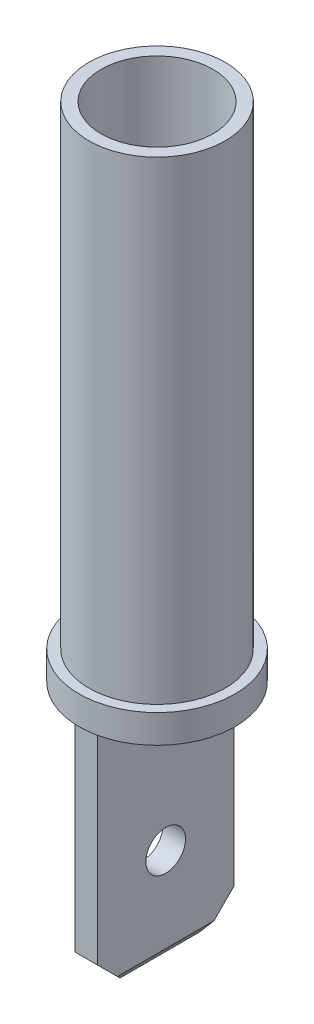
ISO-10303-21;
HEADER;
FILE_DESCRIPTION(('STEP AP214'),'2;1');
FILE_NAME('part.step','',(''),(''),'','','');
FILE_SCHEMA(('AUTOMOTIVE_DESIGN { 1 0 10303 214 1 1 1 1 }'));
ENDSEC;
DATA;
#1=APPLICATION_CONTEXT('core data for automotive mechanical design processes');
#2=APPLICATION_PROTOCOL_DEFINITION('international standard','automotive_design',2000,#1);
#3=PRODUCT_CONTEXT('',#1,'mechanical');
#4=PRODUCT('Part','Part','',(#3));
#5=PRODUCT_RELATED_PRODUCT_CATEGORY('part','',(#4));
#6=PRODUCT_DEFINITION_FORMATION('','',#4);
#7=PRODUCT_DEFINITION_CONTEXT('part definition',#1,'design');
#8=PRODUCT_DEFINITION('design','',#6,#7);
#9=PRODUCT_DEFINITION_SHAPE('','',#8);
#10=(LENGTH_UNIT() NAMED_UNIT(*) SI_UNIT(.MILLI.,.METRE.));
#11=(NAMED_UNIT(*) PLANE_ANGLE_UNIT() SI_UNIT($,.RADIAN.));
#12=(NAMED_UNIT(*) SI_UNIT($,.STERADIAN.) SOLID_ANGLE_UNIT());
#13=UNCERTAINTY_MEASURE_WITH_UNIT(LENGTH_MEASURE(1.E-05),#10,'distance_accuracy_value','');
#14=(GEOMETRIC_REPRESENTATION_CONTEXT(3) GLOBAL_UNCERTAINTY_ASSIGNED_CONTEXT((#13)) GLOBAL_UNIT_ASSIGNED_CONTEXT((#10,
#11,#12)) REPRESENTATION_CONTEXT('',''));
#15=CARTESIAN_POINT('',(0.,0.,0.));
#16=DIRECTION('',(0.,0.,1.));
#17=DIRECTION('',(1.,0.,0.));
#18=AXIS2_PLACEMENT_3D('',#15,#16,#17);
#19=CARTESIAN_POINT('',(0.400000000000001,-8.2,-2.30424845809455));
#20=DIRECTION('',(0.,-1.,0.));
#21=DIRECTION('',(0.,0.,-1.));
#22=AXIS2_PLACEMENT_3D('',#19,#20,#21);
#23=PLANE('',#22);
#24=DIRECTION('',(1.,0.,0.));
#25=VECTOR('',#24,1.);
#26=CARTESIAN_POINT('',(0.400000000000001,-8.2,-1.30424845809455));
#27=LINE('',#26,#25);
#28=CARTESIAN_POINT('',(0.189937738364052,-8.20000000002442,-1.30424845809455));
#29=VERTEX_POINT('',#28);
#30=CARTESIAN_POINT('',(-0.189937738984123,-8.1999999999369,-1.30424845809455));
#31=VERTEX_POINT('',#30);
#32=EDGE_CURVE('E102',#29,#31,#27,.F.);
#33=ORIENTED_EDGE('',*,*,#32,.F.);
#34=DIRECTION('',(0.,0.,1.));
#35=VECTOR('',#34,1.);
#36=CARTESIAN_POINT('',(0.189937738468687,-8.20000000009769,-2.30424845809455));
#37=LINE('',#36,#35);
#38=CARTESIAN_POINT('',(0.18993773829884,-8.20000000002442,1.49575154246425));
#39=VERTEX_POINT('',#38);
#40=EDGE_CURVE('E199',#39,#29,#37,.F.);
#41=ORIENTED_EDGE('',*,*,#40,.F.);
#42=DIRECTION('',(1.,0.,0.));
#43=VECTOR('',#42,1.);
#44=CARTESIAN_POINT('',(0.400000000000001,-8.2,1.49575154265051));
#45=LINE('',#44,#43);
#46=CARTESIAN_POINT('',(-0.189937738984123,-8.1999999999369,1.49575154227798));
#47=VERTEX_POINT('',#46);
#48=EDGE_CURVE('E108',#39,#47,#45,.F.);
#49=ORIENTED_EDGE('',*,*,#48,.T.);
#50=DIRECTION('',(0.,0.,1.));
#51=VECTOR('',#50,1.);
#52=CARTESIAN_POINT('',(-0.189937738713802,-8.19999999974763,-2.30424845809455));
#53=LINE('',#52,#51);
#54=EDGE_CURVE('E106',#31,#47,#53,.T.);
#55=ORIENTED_EDGE('',*,*,#54,.F.);
#56=EDGE_LOOP('',(#33,#41,#49,#55));
#57=FACE_BOUND('',#56,.T.);
#58=ADVANCED_FACE('F17',(#57),#23,.T.);
#59=CARTESIAN_POINT('',(-0.189937738537087,-8.2,-2.30424845809455));
#60=DIRECTION('',(-0.819152044288994,-0.573576436351043,0.));
#61=DIRECTION('',(0.573576436351043,-0.819152044288994,0.));
#62=AXIS2_PLACEMENT_3D('',#59,#60,#61);
#63=PLANE('',#62);
#64=DIRECTION('',(-0.443712605902055,0.633687274356844,-0.63368727435684));
#65=VECTOR('',#64,1.);
#66=CARTESIAN_POINT('',(-0.18993773907423,-8.2,-1.30424845809455));
#67=LINE('',#66,#65);
#68=CARTESIAN_POINT('',(-0.400000000302383,-7.89999999953464,-1.6042484579885));
#69=VERTEX_POINT('',#68);
#70=EDGE_CURVE('E115',#31,#69,#67,.T.);
#71=ORIENTED_EDGE('',*,*,#70,.F.);
#72=ORIENTED_EDGE('',*,*,#54,.T.);
#73=DIRECTION('',(0.44371260545955,-0.633687274511767,-0.633687274511763));
#74=VECTOR('',#73,1.);
#75=CARTESIAN_POINT('',(-0.400000000462119,-7.89999999941673,1.79575154248872));
#76=LINE('',#75,#74);
#77=CARTESIAN_POINT('',(-0.40000000010652,-7.89999999974041,1.79575154215873));
#78=VERTEX_POINT('',#77);
#79=EDGE_CURVE('E196',#78,#47,#76,.T.);
#80=ORIENTED_EDGE('',*,*,#79,.F.);
#81=DIRECTION('',(0.,0.,-1.));
#82=VECTOR('',#81,1.);
#83=CARTESIAN_POINT('',(-0.4,-7.89999999941673,2.49575154190545));
#84=LINE('',#83,#82);
#85=EDGE_CURVE('E118',#78,#69,#84,.T.);
#86=ORIENTED_EDGE('',*,*,#85,.T.);
#87=EDGE_LOOP('',(#71,#72,#80,#86));
#88=FACE_BOUND('',#87,.T.);
#89=ADVANCED_FACE('F116',(#88),#63,.T.);
#90=CARTESIAN_POINT('',(-0.4,-8.2,-2.30424845809455));
#91=DIRECTION('',(0.,0.,1.));
#92=DIRECTION('',(1.,0.,0.));
#93=AXIS2_PLACEMENT_3D('',#90,#91,#92);
#94=PLANE('',#93);
#95=DIRECTION('',(0.,1.,0.));
#96=VECTOR('',#95,1.);
#97=CARTESIAN_POINT('',(0.400000000000001,-8.2,-2.30424845812955));
#98=LINE('',#97,#96);
#99=CARTESIAN_POINT('',(0.400000000062089,0.,-2.30424845802329));
#100=VERTEX_POINT('',#99);
#101=CARTESIAN_POINT('',(0.400000000000001,-7.20000000008438,-2.30424845819643));
#102=VERTEX_POINT('',#101);
#103=EDGE_CURVE('E216',#100,#102,#98,.F.);
#104=ORIENTED_EDGE('',*,*,#103,.T.);
#105=DIRECTION('',(1.,0.,0.));
#106=VECTOR('',#105,1.);
#107=CARTESIAN_POINT('',(0.400000000000001,-7.19999999962747,-2.30424845846708));
#108=LINE('',#107,#106);
#109=CARTESIAN_POINT('',(-0.400000000271819,-7.19999999981373,-2.30424845846708));
#110=VERTEX_POINT('',#109);
#111=EDGE_CURVE('E123',#110,#102,#108,.T.);
#112=ORIENTED_EDGE('',*,*,#111,.F.);
#113=DIRECTION('',(0.,1.,0.));
#114=VECTOR('',#113,1.);
#115=CARTESIAN_POINT('',(-0.4,-8.2,-2.30424845883961));
#116=LINE('',#115,#114);
#117=CARTESIAN_POINT('',(-0.400000000279397,0.,-2.30424845820081));
#118=VERTEX_POINT('',#117);
#119=EDGE_CURVE('E175',#110,#118,#116,.T.);
#120=ORIENTED_EDGE('',*,*,#119,.T.);
#121=DIRECTION('',(1.,0.,0.));
#122=VECTOR('',#121,1.);
#123=CARTESIAN_POINT('',(-0.4,0.,-2.30424845809455));
#124=LINE('',#123,#122);
#125=EDGE_CURVE('E112',#100,#118,#124,.F.);
#126=ORIENTED_EDGE('',*,*,#125,.F.);
#127=EDGE_LOOP('',(#104,#112,#120,#126));
#128=FACE_BOUND('',#127,.T.);
#129=ADVANCED_FACE('F231',(#128),#94,.F.);
#130=CARTESIAN_POINT('',(0.400000000000001,-8.2,-1.30424845809455));
#131=DIRECTION('',(0.,-0.707106781186546,-0.707106781186549));
#132=DIRECTION('',(0.,0.707106781186549,-0.707106781186546));
#133=AXIS2_PLACEMENT_3D('',#130,#131,#132);
#134=PLANE('',#133);
#135=DIRECTION('',(0.,-0.707106780570773,0.707106781802322));
#136=VECTOR('',#135,1.);
#137=CARTESIAN_POINT('',(0.400000000000001,-7.2,-2.30424845883961));
#138=LINE('',#137,#136);
#139=CARTESIAN_POINT('',(0.400000000048028,-7.89999999969214,-1.60424845820621));
#140=VERTEX_POINT('',#139);
#141=EDGE_CURVE('E207',#102,#140,#138,.T.);
#142=ORIENTED_EDGE('',*,*,#141,.T.);
#143=DIRECTION('',(0.443712606522206,0.63368727457104,-0.63368727370841));
#144=VECTOR('',#143,1.);
#145=CARTESIAN_POINT('',(0.189937738468687,-8.20000000009769,-1.30424845809455));
#146=LINE('',#145,#144);
#147=EDGE_CURVE('E127',#29,#140,#146,.T.);
#148=ORIENTED_EDGE('',*,*,#147,.F.);
#149=ORIENTED_EDGE('',*,*,#32,.T.);
#150=ORIENTED_EDGE('',*,*,#70,.T.);
#151=DIRECTION('',(0.,0.707106780433923,-0.707106781939173));
#152=VECTOR('',#151,1.);
#153=CARTESIAN_POINT('',(-0.4,-7.89999999956632,-1.60424845778317));
#154=LINE('',#153,#152);
#155=EDGE_CURVE('E170',#69,#110,#154,.T.);
#156=ORIENTED_EDGE('',*,*,#155,.T.);
#157=ORIENTED_EDGE('',*,*,#111,.T.);
#158=EDGE_LOOP('',(#142,#148,#149,#150,#156,#157));
#159=FACE_BOUND('',#158,.T.);
#160=ADVANCED_FACE('F125',(#159),#134,.T.);
#161=CARTESIAN_POINT('',(0.18993773853709,-8.2,-2.30424845809455));
#162=DIRECTION('',(0.819152044288993,-0.573576436351044,0.));
#163=DIRECTION('',(0.573576436351044,0.819152044288993,0.));
#164=AXIS2_PLACEMENT_3D('',#161,#162,#163);
#165=PLANE('',#164);
#166=DIRECTION('',(0.443712606189862,0.633687274256082,0.633687274256079));
#167=VECTOR('',#166,1.);
#168=CARTESIAN_POINT('',(0.189937738329173,-8.19999999962747,1.49575154227798));
#169=LINE('',#168,#167);
#170=CARTESIAN_POINT('',(0.400000000096055,-7.89999999956711,1.7957515424609));
#171=VERTEX_POINT('',#170);
#172=EDGE_CURVE('E191',#39,#171,#169,.T.);
#173=ORIENTED_EDGE('',*,*,#172,.F.);
#174=ORIENTED_EDGE('',*,*,#40,.T.);
#175=ORIENTED_EDGE('',*,*,#147,.T.);
#176=DIRECTION('',(0.,0.,1.));
#177=VECTOR('',#176,1.);
#178=CARTESIAN_POINT('',(0.400000000000001,-7.89999999956223,2.49575154190545));
#179=LINE('',#178,#177);
#180=EDGE_CURVE('E163',#140,#171,#179,.T.);
#181=ORIENTED_EDGE('',*,*,#180,.T.);
#182=EDGE_LOOP('',(#173,#174,#175,#181));
#183=FACE_BOUND('',#182,.T.);
#184=ADVANCED_FACE('F246',(#183),#165,.T.);
#185=CARTESIAN_POINT('',(0.400000000000001,-8.2,1.49575154190545));
#186=DIRECTION('',(0.,-0.707106781186546,0.707106781186549));
#187=DIRECTION('',(0.,-0.707106781186549,-0.707106781186546));
#188=AXIS2_PLACEMENT_3D('',#185,#186,#187);
#189=PLANE('',#188);
#190=DIRECTION('',(0.,0.707106781186547,0.707106781186548));
#191=VECTOR('',#190,1.);
#192=CARTESIAN_POINT('',(0.400000000000001,-7.89999999925494,1.79575154265051));
#193=LINE('',#192,#191);
#194=CARTESIAN_POINT('',(0.400000000093133,-7.2,2.49575154190545));
#195=VERTEX_POINT('',#194);
#196=EDGE_CURVE('E159',#171,#195,#193,.T.);
#197=ORIENTED_EDGE('',*,*,#196,.T.);
#198=DIRECTION('',(-1.,0.,0.));
#199=VECTOR('',#198,1.);
#200=CARTESIAN_POINT('',(-0.4,-7.2,2.49575154190545));
#201=LINE('',#200,#199);
#202=CARTESIAN_POINT('',(-0.4,-7.20000000019939,2.49575154170606));
#203=VERTEX_POINT('',#202);
#204=EDGE_CURVE('E189',#195,#203,#201,.T.);
#205=ORIENTED_EDGE('',*,*,#204,.T.);
#206=DIRECTION('',(0.,-0.707106781186547,-0.707106781186548));
#207=VECTOR('',#206,1.);
#208=CARTESIAN_POINT('',(-0.4,-7.2,2.49575154190545));
#209=LINE('',#208,#207);
#210=EDGE_CURVE('E179',#203,#78,#209,.T.);
#211=ORIENTED_EDGE('',*,*,#210,.T.);
#212=ORIENTED_EDGE('',*,*,#79,.T.);
#213=ORIENTED_EDGE('',*,*,#48,.F.);
#214=ORIENTED_EDGE('',*,*,#172,.T.);
#215=EDGE_LOOP('',(#197,#205,#211,#212,#213,#214));
#216=FACE_BOUND('',#215,.T.);
#217=ADVANCED_FACE('F243',(#216),#189,.T.);
#218=CARTESIAN_POINT('',(-0.4,-8.2,2.49575154190545));
#219=DIRECTION('',(0.,0.,-1.));
#220=DIRECTION('',(-1.,0.,0.));
#221=AXIS2_PLACEMENT_3D('',#218,#219,#220);
#222=PLANE('',#221);
#223=DIRECTION('',(0.,1.,0.));
#224=VECTOR('',#223,1.);
#225=CARTESIAN_POINT('',(-0.4,-8.2,2.49575154110789));
#226=LINE('',#225,#224);
#227=CARTESIAN_POINT('',(-0.400000000093132,0.,2.49575154150667));
#228=VERTEX_POINT('',#227);
#229=EDGE_CURVE('E183',#228,#203,#226,.F.);
#230=ORIENTED_EDGE('',*,*,#229,.T.);
#231=ORIENTED_EDGE('',*,*,#204,.F.);
#232=DIRECTION('',(0.,1.,0.));
#233=VECTOR('',#232,1.);
#234=CARTESIAN_POINT('',(0.400000000000001,-8.2,2.49575154190545));
#235=LINE('',#234,#233);
#236=CARTESIAN_POINT('',(0.400000000248353,0.,2.49575154170606));
#237=VERTEX_POINT('',#236);
#238=EDGE_CURVE('E156',#195,#237,#235,.T.);
#239=ORIENTED_EDGE('',*,*,#238,.T.);
#240=DIRECTION('',(-1.,0.,0.));
#241=VECTOR('',#240,1.);
#242=CARTESIAN_POINT('',(-0.4,0.,2.49575154190545));
#243=LINE('',#242,#241);
#244=EDGE_CURVE('E42',#228,#237,#243,.F.);
#245=ORIENTED_EDGE('',*,*,#244,.F.);
#246=EDGE_LOOP('',(#230,#231,#239,#245));
#247=FACE_BOUND('',#246,.T.);
#248=ADVANCED_FACE('F241',(#247),#222,.F.);
#249=CARTESIAN_POINT('',(-2.751,-4.9,0.0957515419054487));
#250=DIRECTION('',(1.,0.,0.));
#251=DIRECTION('',(0.,0.,-1.));
#252=AXIS2_PLACEMENT_3D('',#249,#250,#251);
#253=CYLINDRICAL_SURFACE('',#252,0.7);
#254=CARTESIAN_POINT('',(0.400000000000001,-4.9,0.0957515419054487));
#255=DIRECTION('',(1.,0.,0.));
#256=DIRECTION('',(0.,0.,-1.));
#257=AXIS2_PLACEMENT_3D('',#254,#255,#256);
#258=CIRCLE('',#257,0.7);
#259=CARTESIAN_POINT('',(0.400000000000001,-4.9,-0.604248458094551));
#260=VERTEX_POINT('',#259);
#261=EDGE_CURVE('E155',#260,#260,#258,.T.);
#262=ORIENTED_EDGE('',*,*,#261,.T.);
#263=EDGE_LOOP('',(#262));
#264=FACE_BOUND('',#263,.T.);
#265=CARTESIAN_POINT('',(-0.4,-4.9,0.0957515419054487));
#266=DIRECTION('',(1.,0.,0.));
#267=DIRECTION('',(0.,0.,-1.));
#268=AXIS2_PLACEMENT_3D('',#265,#266,#267);
#269=CIRCLE('',#268,0.7);
#270=CARTESIAN_POINT('',(-0.4,-4.9,-0.604248458094551));
#271=VERTEX_POINT('',#270);
#272=EDGE_CURVE('E21',#271,#271,#269,.F.);
#273=ORIENTED_EDGE('',*,*,#272,.T.);
#274=EDGE_LOOP('',(#273));
#275=FACE_BOUND('',#274,.T.);
#276=ADVANCED_FACE('F291',(#264,#275),#253,.F.);
#277=CARTESIAN_POINT('',(-0.4,-8.2,2.49575154190545));
#278=DIRECTION('',(1.,0.,0.));
#279=DIRECTION('',(0.,0.,-1.));
#280=AXIS2_PLACEMENT_3D('',#277,#278,#279);
#281=PLANE('',#280);
#282=ORIENTED_EDGE('',*,*,#272,.F.);
#283=EDGE_LOOP('',(#282));
#284=FACE_BOUND('',#283,.T.);
#285=ORIENTED_EDGE('',*,*,#155,.F.);
#286=ORIENTED_EDGE('',*,*,#85,.F.);
#287=ORIENTED_EDGE('',*,*,#210,.F.);
#288=ORIENTED_EDGE('',*,*,#229,.F.);
#289=DIRECTION('',(0.,0.,1.));
#290=VECTOR('',#289,1.);
#291=CARTESIAN_POINT('',(-0.400000000372529,0.,0.));
#292=LINE('',#291,#290);
#293=EDGE_CURVE('E150',#228,#118,#292,.F.);
#294=ORIENTED_EDGE('',*,*,#293,.T.);
#295=ORIENTED_EDGE('',*,*,#119,.F.);
#296=EDGE_LOOP('',(#285,#286,#287,#288,#294,#295));
#297=FACE_BOUND('',#296,.T.);
#298=ADVANCED_FACE('F234',(#284,#297),#281,.F.);
#299=CARTESIAN_POINT('',(0.400000000000001,-8.2,2.49575154190545));
#300=DIRECTION('',(-1.,0.,0.));
#301=DIRECTION('',(0.,0.,1.));
#302=AXIS2_PLACEMENT_3D('',#299,#300,#301);
#303=PLANE('',#302);
#304=ORIENTED_EDGE('',*,*,#261,.F.);
#305=EDGE_LOOP('',(#304));
#306=FACE_BOUND('',#305,.T.);
#307=ORIENTED_EDGE('',*,*,#196,.F.);
#308=ORIENTED_EDGE('',*,*,#180,.F.);
#309=ORIENTED_EDGE('',*,*,#141,.F.);
#310=ORIENTED_EDGE('',*,*,#103,.F.);
#311=DIRECTION('',(0.,0.,1.));
#312=VECTOR('',#311,1.);
#313=CARTESIAN_POINT('',(0.400000000248353,0.,0.));
#314=LINE('',#313,#312);
#315=EDGE_CURVE('E143',#100,#237,#314,.T.);
#316=ORIENTED_EDGE('',*,*,#315,.T.);
#317=ORIENTED_EDGE('',*,*,#238,.F.);
#318=EDGE_LOOP('',(#307,#308,#309,#310,#316,#317));
#319=FACE_BOUND('',#318,.T.);
#320=ADVANCED_FACE('F215',(#306,#319),#303,.F.);
#321=CARTESIAN_POINT('',(0.,1.,0.));
#322=DIRECTION('',(0.,1.,0.));
#323=DIRECTION('',(0.,0.,1.));
#324=AXIS2_PLACEMENT_3D('',#321,#322,#323);
#325=PLANE('',#324);
#326=CARTESIAN_POINT('',(0.,0.999999999999998,0.));
#327=DIRECTION('',(0.,1.,0.));
#328=DIRECTION('',(0.,0.,1.));
#329=AXIS2_PLACEMENT_3D('',#326,#327,#328);
#330=CIRCLE('',#329,0.97);
#331=CARTESIAN_POINT('',(0.,0.999999999999998,0.97));
#332=VERTEX_POINT('',#331);
#333=EDGE_CURVE('E149',#332,#332,#330,.F.);
#334=ORIENTED_EDGE('',*,*,#333,.F.);
#335=EDGE_LOOP('',(#334));
#336=FACE_BOUND('',#335,.T.);
#337=ADVANCED_FACE('F282',(#336),#325,.T.);
#338=CARTESIAN_POINT('',(0.,0.,0.));
#339=DIRECTION('',(0.,1.,0.));
#340=DIRECTION('',(0.,0.,1.));
#341=AXIS2_PLACEMENT_3D('',#338,#339,#340);
#342=PLANE('',#341);
#343=ORIENTED_EDGE('',*,*,#315,.F.);
#344=ORIENTED_EDGE('',*,*,#125,.T.);
#345=ORIENTED_EDGE('',*,*,#293,.F.);
#346=ORIENTED_EDGE('',*,*,#244,.T.);
#347=EDGE_LOOP('',(#343,#344,#345,#346));
#348=FACE_BOUND('',#347,.T.);
#349=CARTESIAN_POINT('',(0.,0.,0.));
#350=DIRECTION('',(0.,-1.,0.));
#351=DIRECTION('',(0.,0.,-1.));
#352=AXIS2_PLACEMENT_3D('',#349,#350,#351);
#353=CIRCLE('',#352,2.75);
#354=CARTESIAN_POINT('',(0.,0.,-2.75));
#355=VERTEX_POINT('',#354);
#356=EDGE_CURVE('E372',#355,#355,#353,.F.);
#357=ORIENTED_EDGE('',*,*,#356,.F.);
#358=EDGE_LOOP('',(#357));
#359=FACE_BOUND('',#358,.T.);
#360=ADVANCED_FACE('F236',(#348,#359),#342,.F.);
#361=CARTESIAN_POINT('',(0.,1.99999999999998,0.));
#362=DIRECTION('',(0.,1.,0.));
#363=DIRECTION('',(0.,0.,1.));
#364=AXIS2_PLACEMENT_3D('',#361,#362,#363);
#365=DEGENERATE_TOROIDAL_SURFACE('',#364,0.97,0.999999999999978,.T.);
#366=CARTESIAN_POINT('',(0.,2.,0.));
#367=DIRECTION('',(0.,-1.,0.));
#368=DIRECTION('',(0.,0.,-1.));
#369=AXIS2_PLACEMENT_3D('',#366,#367,#368);
#370=CIRCLE('',#369,1.97);
#371=CARTESIAN_POINT('',(0.,2.,-1.97));
#372=VERTEX_POINT('',#371);
#373=EDGE_CURVE('E151',#372,#372,#370,.F.);
#374=ORIENTED_EDGE('',*,*,#373,.T.);
#375=EDGE_LOOP('',(#374));
#376=FACE_BOUND('',#375,.T.);
#377=ORIENTED_EDGE('',*,*,#333,.T.);
#378=EDGE_LOOP('',(#377));
#379=FACE_BOUND('',#378,.T.);
#380=ADVANCED_FACE('F19',(#376,#379),#365,.F.);
#381=CARTESIAN_POINT('',(0.,1.,0.));
#382=DIRECTION('',(0.,-1.,0.));
#383=DIRECTION('',(0.,0.,-1.));
#384=AXIS2_PLACEMENT_3D('',#381,#382,#383);
#385=CYLINDRICAL_SURFACE('',#384,2.75);
#386=CARTESIAN_POINT('',(0.,1.,0.));
#387=DIRECTION('',(0.,-1.,0.));
#388=DIRECTION('',(0.,0.,-1.));
#389=AXIS2_PLACEMENT_3D('',#386,#387,#388);
#390=CIRCLE('',#389,2.75);
#391=CARTESIAN_POINT('',(0.,1.,-2.75));
#392=VERTEX_POINT('',#391);
#393=EDGE_CURVE('E364',#392,#392,#390,.F.);
#394=ORIENTED_EDGE('',*,*,#393,.F.);
#395=EDGE_LOOP('',(#394));
#396=FACE_BOUND('',#395,.T.);
#397=ORIENTED_EDGE('',*,*,#356,.T.);
#398=EDGE_LOOP('',(#397));
#399=FACE_BOUND('',#398,.T.);
#400=ADVANCED_FACE('F275',(#396,#399),#385,.T.);
#401=CARTESIAN_POINT('',(0.,17.7,0.));
#402=DIRECTION('',(0.,-1.,0.));
#403=DIRECTION('',(0.,0.,-1.));
#404=AXIS2_PLACEMENT_3D('',#401,#402,#403);
#405=CYLINDRICAL_SURFACE('',#404,1.97);
#406=ORIENTED_EDGE('',*,*,#373,.F.);
#407=EDGE_LOOP('',(#406));
#408=FACE_BOUND('',#407,.T.);
#409=CARTESIAN_POINT('',(0.,17.7,0.));
#410=DIRECTION('',(0.,-1.,0.));
#411=DIRECTION('',(0.,0.,-1.));
#412=AXIS2_PLACEMENT_3D('',#409,#410,#411);
#413=CIRCLE('',#412,1.97);
#414=CARTESIAN_POINT('',(0.,17.7,-1.97));
#415=VERTEX_POINT('',#414);
#416=EDGE_CURVE('E360',#415,#415,#413,.T.);
#417=ORIENTED_EDGE('',*,*,#416,.F.);
#418=EDGE_LOOP('',(#417));
#419=FACE_BOUND('',#418,.T.);
#420=ADVANCED_FACE('F271',(#408,#419),#405,.F.);
#421=CARTESIAN_POINT('',(0.,1.,0.));
#422=DIRECTION('',(0.,1.,0.));
#423=DIRECTION('',(0.,0.,1.));
#424=AXIS2_PLACEMENT_3D('',#421,#422,#423);
#425=PLANE('',#424);
#426=CARTESIAN_POINT('',(0.,1.00000000074506,0.));
#427=DIRECTION('',(0.,-1.,0.));
#428=DIRECTION('',(0.,0.,-1.));
#429=AXIS2_PLACEMENT_3D('',#426,#427,#428);
#430=CIRCLE('',#429,2.4);
#431=CARTESIAN_POINT('',(0.,1.00000000074506,-2.4));
#432=VERTEX_POINT('',#431);
#433=EDGE_CURVE('E28',#432,#432,#430,.F.);
#434=ORIENTED_EDGE('',*,*,#433,.F.);
#435=EDGE_LOOP('',(#434));
#436=FACE_BOUND('',#435,.T.);
#437=ORIENTED_EDGE('',*,*,#393,.T.);
#438=EDGE_LOOP('',(#437));
#439=FACE_BOUND('',#438,.T.);
#440=ADVANCED_FACE('F264',(#436,#439),#425,.T.);
#441=CARTESIAN_POINT('',(0.,17.7,0.));
#442=DIRECTION('',(0.,1.,0.));
#443=DIRECTION('',(0.,0.,1.));
#444=AXIS2_PLACEMENT_3D('',#441,#442,#443);
#445=PLANE('',#444);
#446=ORIENTED_EDGE('',*,*,#416,.T.);
#447=EDGE_LOOP('',(#446));
#448=FACE_BOUND('',#447,.T.);
#449=CARTESIAN_POINT('',(0.,17.7,0.));
#450=DIRECTION('',(0.,-1.,0.));
#451=DIRECTION('',(0.,0.,-1.));
#452=AXIS2_PLACEMENT_3D('',#449,#450,#451);
#453=CIRCLE('',#452,2.4);
#454=CARTESIAN_POINT('',(0.,17.7,-2.4));
#455=VERTEX_POINT('',#454);
#456=EDGE_CURVE('E10',#455,#455,#453,.T.);
#457=ORIENTED_EDGE('',*,*,#456,.F.);
#458=EDGE_LOOP('',(#457));
#459=FACE_BOUND('',#458,.T.);
#460=ADVANCED_FACE('F258',(#448,#459),#445,.T.);
#461=CARTESIAN_POINT('',(0.,17.7,0.));
#462=DIRECTION('',(0.,-1.,0.));
#463=DIRECTION('',(0.,0.,-1.));
#464=AXIS2_PLACEMENT_3D('',#461,#462,#463);
#465=CYLINDRICAL_SURFACE('',#464,2.4);
#466=ORIENTED_EDGE('',*,*,#456,.T.);
#467=EDGE_LOOP('',(#466));
#468=FACE_BOUND('',#467,.T.);
#469=ORIENTED_EDGE('',*,*,#433,.T.);
#470=EDGE_LOOP('',(#469));
#471=FACE_BOUND('',#470,.T.);
#472=ADVANCED_FACE('F256',(#468,#471),#465,.T.);
#473=CLOSED_SHELL('',(#58,#89,#129,#160,#184,#217,#248,#276,#298,#320,#337,#360,#380,#400,#420,
#440,#460,#472));
#474=MANIFOLD_SOLID_BREP('B1',#473);
#475=ADVANCED_BREP_SHAPE_REPRESENTATION('',(#18,#474),#14);
#476=SHAPE_DEFINITION_REPRESENTATION(#9,#475);
ENDSEC;
END-ISO-10303-21;
